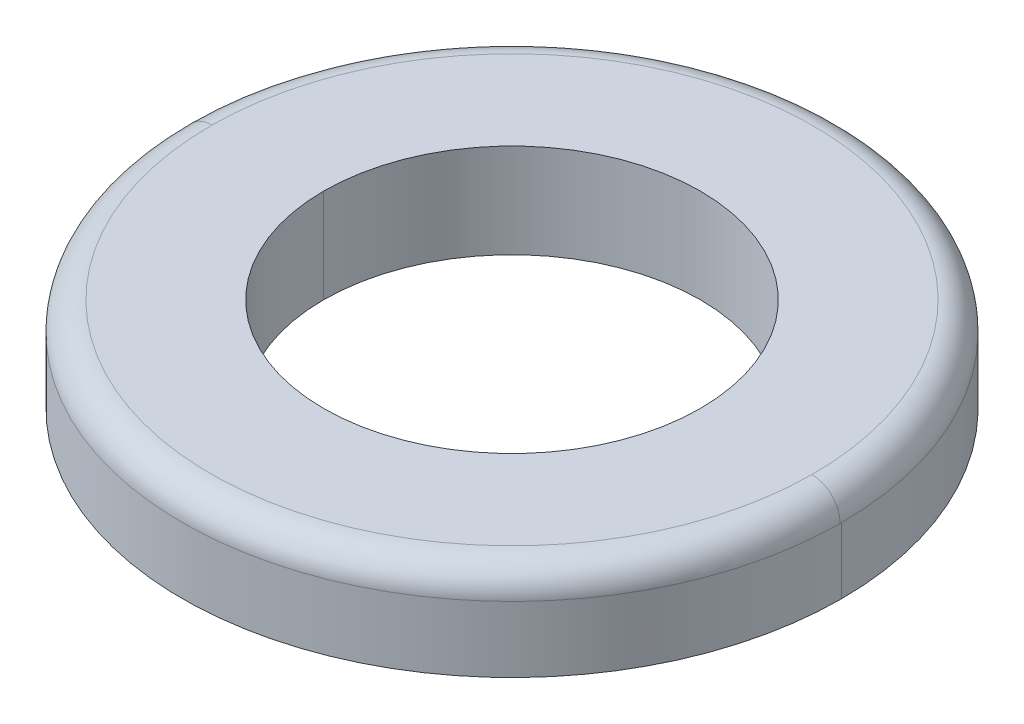
ISO-10303-21;
HEADER;
FILE_DESCRIPTION(('STEP AP214'),'2;1');
FILE_NAME('part.step','',(''),(''),'','','');
FILE_SCHEMA(('AUTOMOTIVE_DESIGN { 1 0 10303 214 1 1 1 1 }'));
ENDSEC;
DATA;
#1=APPLICATION_CONTEXT('core data for automotive mechanical design processes');
#2=APPLICATION_PROTOCOL_DEFINITION('international standard','automotive_design',2000,#1);
#3=PRODUCT_CONTEXT('',#1,'mechanical');
#4=PRODUCT('Part','Part','',(#3));
#5=PRODUCT_RELATED_PRODUCT_CATEGORY('part','',(#4));
#6=PRODUCT_DEFINITION_FORMATION('','',#4);
#7=PRODUCT_DEFINITION_CONTEXT('part definition',#1,'design');
#8=PRODUCT_DEFINITION('design','',#6,#7);
#9=PRODUCT_DEFINITION_SHAPE('','',#8);
#10=(LENGTH_UNIT() NAMED_UNIT(*) SI_UNIT(.MILLI.,.METRE.));
#11=(NAMED_UNIT(*) PLANE_ANGLE_UNIT() SI_UNIT($,.RADIAN.));
#12=(NAMED_UNIT(*) SI_UNIT($,.STERADIAN.) SOLID_ANGLE_UNIT());
#13=UNCERTAINTY_MEASURE_WITH_UNIT(LENGTH_MEASURE(1.E-05),#10,'distance_accuracy_value','');
#14=(GEOMETRIC_REPRESENTATION_CONTEXT(3) GLOBAL_UNCERTAINTY_ASSIGNED_CONTEXT((#13)) GLOBAL_UNIT_ASSIGNED_CONTEXT((#10,
#11,#12)) REPRESENTATION_CONTEXT('',''));
#15=CARTESIAN_POINT('',(0.,0.,0.));
#16=DIRECTION('',(0.,0.,1.));
#17=DIRECTION('',(1.,0.,0.));
#18=AXIS2_PLACEMENT_3D('',#15,#16,#17);
#19=CARTESIAN_POINT('',(0.,0.7,0.));
#20=DIRECTION('',(0.,1.,0.));
#21=DIRECTION('',(0.999990438639547,0.,0.0043729428863112));
#22=AXIS2_PLACEMENT_3D('',#19,#20,#21);
#23=TOROIDAL_SURFACE('',#22,3.2,0.3);
#24=CARTESIAN_POINT('',(0.,1.,0.));
#25=DIRECTION('',(0.,-1.,0.));
#26=DIRECTION('',(-0.999990438702669,0.,-0.00437292845165411));
#27=AXIS2_PLACEMENT_3D('',#24,#25,#26);
#28=CIRCLE('',#27,3.2);
#29=CARTESIAN_POINT('',(3.19996940364655,1.,0.0139934172361959));
#30=VERTEX_POINT('',#29);
#31=CARTESIAN_POINT('',(-3.19996940364655,1.,-0.0139934172361959));
#32=VERTEX_POINT('',#31);
#33=EDGE_CURVE('E138',#30,#32,#28,.T.);
#34=ORIENTED_EDGE('',*,*,#33,.T.);
#35=CARTESIAN_POINT('',(-3.19996940364655,0.7,-0.0139934172361959));
#36=DIRECTION('',(-0.0043729428863112,0.,0.999990438639547));
#37=DIRECTION('',(-0.999990438639547,0.,-0.0043729428863112));
#38=AXIS2_PLACEMENT_3D('',#35,#36,#37);
#39=CIRCLE('',#38,0.3);
#40=CARTESIAN_POINT('',(-3.49996653523841,0.7,-0.0153053001020892));
#41=VERTEX_POINT('',#40);
#42=EDGE_CURVE('E112',#32,#41,#39,.T.);
#43=ORIENTED_EDGE('',*,*,#42,.T.);
#44=CARTESIAN_POINT('',(0.,0.7,0.));
#45=DIRECTION('',(0.,-1.,0.));
#46=DIRECTION('',(-0.999990438639547,0.,-0.00437294288631116));
#47=AXIS2_PLACEMENT_3D('',#44,#45,#46);
#48=CIRCLE('',#47,3.5);
#49=CARTESIAN_POINT('',(-3.5,0.7,0.));
#50=VERTEX_POINT('',#49);
#51=EDGE_CURVE('E11',#50,#41,#48,.T.);
#52=ORIENTED_EDGE('',*,*,#51,.F.);
#53=CARTESIAN_POINT('',(0.,0.7,0.));
#54=DIRECTION('',(0.,-1.,0.));
#55=DIRECTION('',(-0.999990438639547,0.,-0.00437294288631116));
#56=AXIS2_PLACEMENT_3D('',#53,#54,#55);
#57=CIRCLE('',#56,3.5);
#58=CARTESIAN_POINT('',(3.49996653523841,0.7,0.0153053001020892));
#59=VERTEX_POINT('',#58);
#60=EDGE_CURVE('E90',#59,#50,#57,.T.);
#61=ORIENTED_EDGE('',*,*,#60,.F.);
#62=CARTESIAN_POINT('',(3.19996940364655,0.7,0.0139934172361959));
#63=DIRECTION('',(0.0043729428863112,0.,-0.999990438639547));
#64=DIRECTION('',(0.999990438639547,0.,0.0043729428863112));
#65=AXIS2_PLACEMENT_3D('',#62,#63,#64);
#66=CIRCLE('',#65,0.3);
#67=EDGE_CURVE('E135',#30,#59,#66,.T.);
#68=ORIENTED_EDGE('',*,*,#67,.F.);
#69=EDGE_LOOP('',(#34,#43,#52,#61,#68));
#70=FACE_BOUND('',#69,.T.);
#71=ADVANCED_FACE('F17',(#70),#23,.T.);
#72=CARTESIAN_POINT('',(0.,0.,0.));
#73=DIRECTION('',(0.,1.,0.));
#74=DIRECTION('',(1.,0.,0.));
#75=AXIS2_PLACEMENT_3D('',#72,#73,#74);
#76=CYLINDRICAL_SURFACE('',#75,3.5);
#77=DIRECTION('',(0.,1.,0.));
#78=VECTOR('',#77,1.);
#79=CARTESIAN_POINT('',(3.5,0.,0.));
#80=LINE('',#79,#78);
#81=CARTESIAN_POINT('',(3.5,0.,0.));
#82=VERTEX_POINT('',#81);
#83=CARTESIAN_POINT('',(3.5,0.7,0.));
#84=VERTEX_POINT('',#83);
#85=EDGE_CURVE('E98',#82,#84,#80,.T.);
#86=ORIENTED_EDGE('',*,*,#85,.F.);
#87=CARTESIAN_POINT('',(0.,0.,0.));
#88=DIRECTION('',(0.,1.,0.));
#89=DIRECTION('',(1.,0.,0.));
#90=AXIS2_PLACEMENT_3D('',#87,#88,#89);
#91=CIRCLE('',#90,3.5);
#92=CARTESIAN_POINT('',(-3.5,0.,0.));
#93=VERTEX_POINT('',#92);
#94=EDGE_CURVE('E96',#82,#93,#91,.T.);
#95=ORIENTED_EDGE('',*,*,#94,.T.);
#96=DIRECTION('',(0.,1.,0.));
#97=VECTOR('',#96,1.);
#98=CARTESIAN_POINT('',(-3.5,0.,0.));
#99=LINE('',#98,#97);
#100=EDGE_CURVE('E82',#93,#50,#99,.T.);
#101=ORIENTED_EDGE('',*,*,#100,.T.);
#102=ORIENTED_EDGE('',*,*,#51,.T.);
#103=CARTESIAN_POINT('',(0.,0.7,0.));
#104=DIRECTION('',(0.,-1.,0.));
#105=DIRECTION('',(-0.999990438639547,0.,-0.00437294288631116));
#106=AXIS2_PLACEMENT_3D('',#103,#104,#105);
#107=CIRCLE('',#106,3.5);
#108=EDGE_CURVE('E93',#41,#84,#107,.T.);
#109=ORIENTED_EDGE('',*,*,#108,.T.);
#110=EDGE_LOOP('',(#86,#95,#101,#102,#109));
#111=FACE_BOUND('',#110,.T.);
#112=ADVANCED_FACE('F97',(#111),#76,.T.);
#113=CARTESIAN_POINT('',(0.,0.,0.));
#114=DIRECTION('',(0.,1.,0.));
#115=DIRECTION('',(1.,0.,0.));
#116=AXIS2_PLACEMENT_3D('',#113,#114,#115);
#117=CYLINDRICAL_SURFACE('',#116,2.);
#118=CARTESIAN_POINT('',(0.,0.,0.));
#119=DIRECTION('',(0.,-1.,0.));
#120=DIRECTION('',(1.,0.,0.));
#121=AXIS2_PLACEMENT_3D('',#118,#119,#120);
#122=CIRCLE('',#121,2.);
#123=CARTESIAN_POINT('',(-2.,0.,0.));
#124=VERTEX_POINT('',#123);
#125=CARTESIAN_POINT('',(2.,0.,0.));
#126=VERTEX_POINT('',#125);
#127=EDGE_CURVE('E101',#124,#126,#122,.T.);
#128=ORIENTED_EDGE('',*,*,#127,.T.);
#129=DIRECTION('',(0.,1.,0.));
#130=VECTOR('',#129,1.);
#131=CARTESIAN_POINT('',(2.,0.,0.));
#132=LINE('',#131,#130);
#133=CARTESIAN_POINT('',(2.,1.,0.));
#134=VERTEX_POINT('',#133);
#135=EDGE_CURVE('E38',#126,#134,#132,.T.);
#136=ORIENTED_EDGE('',*,*,#135,.T.);
#137=CARTESIAN_POINT('',(0.,1.,0.));
#138=DIRECTION('',(0.,1.,0.));
#139=DIRECTION('',(-1.,0.,0.));
#140=AXIS2_PLACEMENT_3D('',#137,#138,#139);
#141=CIRCLE('',#140,2.);
#142=CARTESIAN_POINT('',(-2.,1.,0.));
#143=VERTEX_POINT('',#142);
#144=EDGE_CURVE('E122',#134,#143,#141,.T.);
#145=ORIENTED_EDGE('',*,*,#144,.T.);
#146=DIRECTION('',(0.,1.,0.));
#147=VECTOR('',#146,1.);
#148=CARTESIAN_POINT('',(-2.,0.,0.));
#149=LINE('',#148,#147);
#150=EDGE_CURVE('E26',#124,#143,#149,.T.);
#151=ORIENTED_EDGE('',*,*,#150,.F.);
#152=EDGE_LOOP('',(#128,#136,#145,#151));
#153=FACE_BOUND('',#152,.T.);
#154=ADVANCED_FACE('F163',(#153),#117,.F.);
#155=CARTESIAN_POINT('',(0.,0.,0.));
#156=DIRECTION('',(0.,1.,0.));
#157=DIRECTION('',(1.,0.,0.));
#158=AXIS2_PLACEMENT_3D('',#155,#156,#157);
#159=CYLINDRICAL_SURFACE('',#158,2.);
#160=CARTESIAN_POINT('',(0.,1.,0.));
#161=DIRECTION('',(0.,1.,0.));
#162=DIRECTION('',(-1.,0.,0.));
#163=AXIS2_PLACEMENT_3D('',#160,#161,#162);
#164=CIRCLE('',#163,2.);
#165=EDGE_CURVE('E110',#143,#134,#164,.T.);
#166=ORIENTED_EDGE('',*,*,#165,.T.);
#167=ORIENTED_EDGE('',*,*,#135,.F.);
#168=CARTESIAN_POINT('',(0.,0.,0.));
#169=DIRECTION('',(0.,-1.,0.));
#170=DIRECTION('',(1.,0.,0.));
#171=AXIS2_PLACEMENT_3D('',#168,#169,#170);
#172=CIRCLE('',#171,2.);
#173=EDGE_CURVE('E119',#126,#124,#172,.T.);
#174=ORIENTED_EDGE('',*,*,#173,.T.);
#175=ORIENTED_EDGE('',*,*,#150,.T.);
#176=EDGE_LOOP('',(#166,#167,#174,#175));
#177=FACE_BOUND('',#176,.T.);
#178=ADVANCED_FACE('F158',(#177),#159,.F.);
#179=CARTESIAN_POINT('',(0.,1.,0.));
#180=DIRECTION('',(0.,1.,0.));
#181=DIRECTION('',(1.,0.,0.));
#182=AXIS2_PLACEMENT_3D('',#179,#180,#181);
#183=PLANE('',#182);
#184=ORIENTED_EDGE('',*,*,#165,.F.);
#185=ORIENTED_EDGE('',*,*,#144,.F.);
#186=EDGE_LOOP('',(#184,#185));
#187=FACE_BOUND('',#186,.T.);
#188=ORIENTED_EDGE('',*,*,#33,.F.);
#189=CARTESIAN_POINT('',(0.,1.,0.));
#190=DIRECTION('',(0.,-1.,0.));
#191=DIRECTION('',(-0.999990438702669,0.,-0.00437292845165411));
#192=AXIS2_PLACEMENT_3D('',#189,#190,#191);
#193=CIRCLE('',#192,3.2);
#194=EDGE_CURVE('E116',#32,#30,#193,.T.);
#195=ORIENTED_EDGE('',*,*,#194,.F.);
#196=EDGE_LOOP('',(#188,#195));
#197=FACE_BOUND('',#196,.T.);
#198=ADVANCED_FACE('F161',(#187,#197),#183,.T.);
#199=CARTESIAN_POINT('',(0.,0.7,0.));
#200=DIRECTION('',(0.,1.,0.));
#201=DIRECTION('',(0.999990438639547,0.,0.0043729428863112));
#202=AXIS2_PLACEMENT_3D('',#199,#200,#201);
#203=TOROIDAL_SURFACE('',#202,3.2,0.3);
#204=CARTESIAN_POINT('',(0.,0.7,0.));
#205=DIRECTION('',(0.,-1.,0.));
#206=DIRECTION('',(-0.999990438639547,0.,-0.00437294288631116));
#207=AXIS2_PLACEMENT_3D('',#204,#205,#206);
#208=CIRCLE('',#207,3.5);
#209=EDGE_CURVE('E130',#84,#59,#208,.T.);
#210=ORIENTED_EDGE('',*,*,#209,.F.);
#211=ORIENTED_EDGE('',*,*,#108,.F.);
#212=ORIENTED_EDGE('',*,*,#42,.F.);
#213=ORIENTED_EDGE('',*,*,#194,.T.);
#214=ORIENTED_EDGE('',*,*,#67,.T.);
#215=EDGE_LOOP('',(#210,#211,#212,#213,#214));
#216=FACE_BOUND('',#215,.T.);
#217=ADVANCED_FACE('F173',(#216),#203,.T.);
#218=CARTESIAN_POINT('',(0.,0.,0.));
#219=DIRECTION('',(0.,1.,0.));
#220=DIRECTION('',(1.,0.,0.));
#221=AXIS2_PLACEMENT_3D('',#218,#219,#220);
#222=CYLINDRICAL_SURFACE('',#221,3.5);
#223=CARTESIAN_POINT('',(0.,0.,0.));
#224=DIRECTION('',(0.,1.,0.));
#225=DIRECTION('',(1.,0.,0.));
#226=AXIS2_PLACEMENT_3D('',#223,#224,#225);
#227=CIRCLE('',#226,3.5);
#228=EDGE_CURVE('E87',#93,#82,#227,.T.);
#229=ORIENTED_EDGE('',*,*,#228,.T.);
#230=ORIENTED_EDGE('',*,*,#85,.T.);
#231=ORIENTED_EDGE('',*,*,#209,.T.);
#232=ORIENTED_EDGE('',*,*,#60,.T.);
#233=ORIENTED_EDGE('',*,*,#100,.F.);
#234=EDGE_LOOP('',(#229,#230,#231,#232,#233));
#235=FACE_BOUND('',#234,.T.);
#236=ADVANCED_FACE('F84',(#235),#222,.T.);
#237=CARTESIAN_POINT('',(0.,0.,0.));
#238=DIRECTION('',(0.,1.,0.));
#239=DIRECTION('',(1.,0.,0.));
#240=AXIS2_PLACEMENT_3D('',#237,#238,#239);
#241=PLANE('',#240);
#242=ORIENTED_EDGE('',*,*,#127,.F.);
#243=ORIENTED_EDGE('',*,*,#173,.F.);
#244=EDGE_LOOP('',(#242,#243));
#245=FACE_BOUND('',#244,.T.);
#246=ORIENTED_EDGE('',*,*,#228,.F.);
#247=ORIENTED_EDGE('',*,*,#94,.F.);
#248=EDGE_LOOP('',(#246,#247));
#249=FACE_BOUND('',#248,.T.);
#250=ADVANCED_FACE('F103',(#245,#249),#241,.F.);
#251=CLOSED_SHELL('',(#71,#112,#154,#178,#198,#217,#236,#250));
#252=MANIFOLD_SOLID_BREP('B1',#251);
#253=ADVANCED_BREP_SHAPE_REPRESENTATION('',(#18,#252),#14);
#254=SHAPE_DEFINITION_REPRESENTATION(#9,#253);
ENDSEC;
END-ISO-10303-21;
